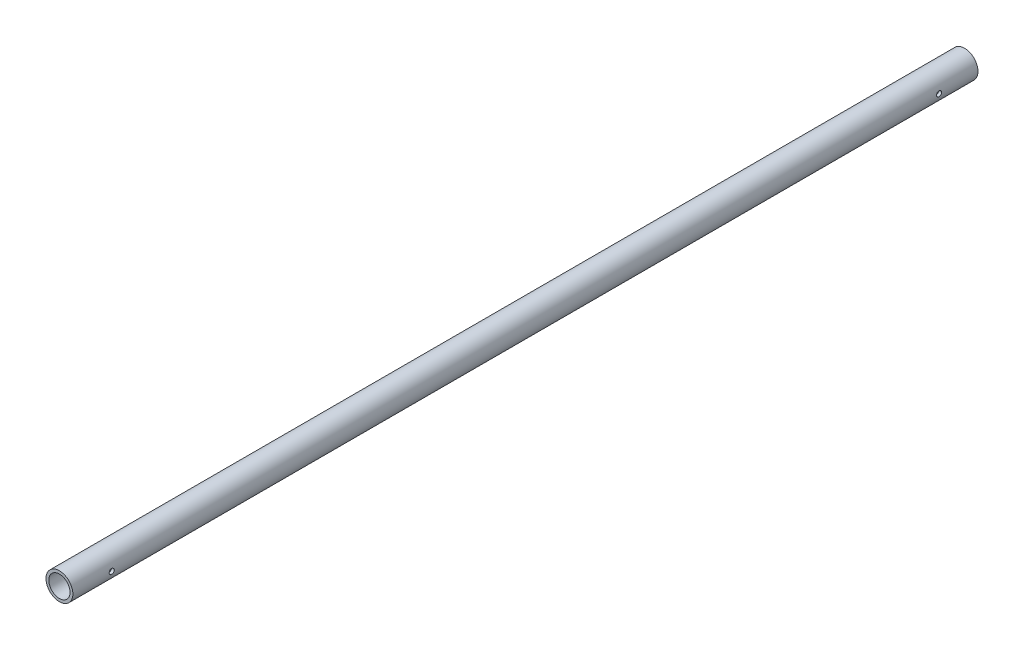
ISO-10303-21;
HEADER;
FILE_DESCRIPTION(('STEP AP214'),'2;1');
FILE_NAME('part.step','',(''),(''),'','','');
FILE_SCHEMA(('AUTOMOTIVE_DESIGN { 1 0 10303 214 1 1 1 1 }'));
ENDSEC;
DATA;
#1=APPLICATION_CONTEXT('core data for automotive mechanical design processes');
#2=APPLICATION_PROTOCOL_DEFINITION('international standard','automotive_design',2000,#1);
#3=PRODUCT_CONTEXT('',#1,'mechanical');
#4=PRODUCT('Part','Part','',(#3));
#5=PRODUCT_RELATED_PRODUCT_CATEGORY('part','',(#4));
#6=PRODUCT_DEFINITION_FORMATION('','',#4);
#7=PRODUCT_DEFINITION_CONTEXT('part definition',#1,'design');
#8=PRODUCT_DEFINITION('design','',#6,#7);
#9=PRODUCT_DEFINITION_SHAPE('','',#8);
#10=(LENGTH_UNIT() NAMED_UNIT(*) SI_UNIT(.MILLI.,.METRE.));
#11=(NAMED_UNIT(*) PLANE_ANGLE_UNIT() SI_UNIT($,.RADIAN.));
#12=(NAMED_UNIT(*) SI_UNIT($,.STERADIAN.) SOLID_ANGLE_UNIT());
#13=UNCERTAINTY_MEASURE_WITH_UNIT(LENGTH_MEASURE(1.E-05),#10,'distance_accuracy_value','');
#14=(GEOMETRIC_REPRESENTATION_CONTEXT(3) GLOBAL_UNCERTAINTY_ASSIGNED_CONTEXT((#13)) GLOBAL_UNIT_ASSIGNED_CONTEXT((#10,
#11,#12)) REPRESENTATION_CONTEXT('',''));
#15=CARTESIAN_POINT('',(0.,0.,0.));
#16=DIRECTION('',(0.,0.,1.));
#17=DIRECTION('',(1.,0.,0.));
#18=AXIS2_PLACEMENT_3D('',#15,#16,#17);
#19=CARTESIAN_POINT('',(0.,0.,406.4));
#20=DIRECTION('',(0.,0.,-1.));
#21=DIRECTION('',(-1.,0.,0.));
#22=AXIS2_PLACEMENT_3D('',#19,#20,#21);
#23=CYLINDRICAL_SURFACE('',#22,12.065);
#24=CARTESIAN_POINT('',(0.,0.,406.4));
#25=DIRECTION('',(0.,0.,1.));
#26=DIRECTION('',(1.,0.,0.));
#27=AXIS2_PLACEMENT_3D('',#24,#25,#26);
#28=CIRCLE('',#27,12.065);
#29=CARTESIAN_POINT('',(12.065,0.,406.4));
#30=VERTEX_POINT('',#29);
#31=EDGE_CURVE('E12',#30,#30,#28,.T.);
#32=ORIENTED_EDGE('',*,*,#31,.F.);
#33=EDGE_LOOP('',(#32));
#34=FACE_BOUND('',#33,.T.);
#35=CARTESIAN_POINT('',(0.,0.,-406.4));
#36=DIRECTION('',(0.,0.,1.));
#37=DIRECTION('',(1.,0.,0.));
#38=AXIS2_PLACEMENT_3D('',#35,#36,#37);
#39=CIRCLE('',#38,12.065);
#40=CARTESIAN_POINT('',(12.065,0.,-406.4));
#41=VERTEX_POINT('',#40);
#42=EDGE_CURVE('E49',#41,#41,#39,.T.);
#43=ORIENTED_EDGE('',*,*,#42,.T.);
#44=EDGE_LOOP('',(#43));
#45=FACE_BOUND('',#44,.T.);
#46=CARTESIAN_POINT('',(12.065,0.,373.761));
#47=CARTESIAN_POINT('',(12.0649976884321,0.12718599928569,373.760995166601));
#48=CARTESIAN_POINT('',(12.0629681130692,0.254434606003906,373.75034977691));
#49=CARTESIAN_POINT('',(12.0550673796494,0.505344333296518,373.70807788682));
#50=CARTESIAN_POINT('',(12.0491930087331,0.62900236311112,373.676433838825));
#51=CARTESIAN_POINT('',(12.0342596274528,0.86906610083774,373.593169719001));
#52=CARTESIAN_POINT('',(12.0252035207742,0.985478307718792,373.541567856567));
#53=CARTESIAN_POINT('',(12.0048949007203,1.20798239423987,373.419904958793));
#54=CARTESIAN_POINT('',(11.9936425578778,1.31407507421027,373.349845356507));
#55=CARTESIAN_POINT('',(11.9700291907526,1.51423499657303,373.192347294512));
#56=CARTESIAN_POINT('',(11.957657381634,1.6081579401749,373.104727047653));
#57=CARTESIAN_POINT('',(11.9332792621731,1.78006376066271,372.914985920394));
#58=CARTESIAN_POINT('',(11.9212729784833,1.85804547754153,372.812863985656));
#59=CARTESIAN_POINT('',(11.8988803987853,1.99645756333052,372.595995778333));
#60=CARTESIAN_POINT('',(11.8885080036478,2.05674074079455,372.481154001807));
#61=CARTESIAN_POINT('',(11.8707097448294,2.15710216113587,372.242743401801));
#62=CARTESIAN_POINT('',(11.8632836214172,2.19718218512528,372.119175348726));
#63=CARTESIAN_POINT('',(11.8523273520419,2.25553564429627,371.868365144754));
#64=CARTESIAN_POINT('',(11.8487522409,2.27406096594662,371.741183601051));
#65=CARTESIAN_POINT('',(11.845767249493,2.28956107931153,371.485471108973));
#66=CARTESIAN_POINT('',(11.8463569876959,2.28653784503818,371.356940285279));
#67=CARTESIAN_POINT('',(11.8515941366628,2.25923082112956,371.104005399244));
#68=CARTESIAN_POINT('',(11.8561868114863,2.23523381348081,370.979569074732));
#69=CARTESIAN_POINT('',(11.8688263468142,2.16711222768597,370.736521149793));
#70=CARTESIAN_POINT('',(11.8768733569103,2.12298677786224,370.617909801866));
#71=CARTESIAN_POINT('',(11.8955718925247,2.01558142696362,370.389041607623));
#72=CARTESIAN_POINT('',(11.9062390425539,1.95218605530477,370.278840279661));
#73=CARTESIAN_POINT('',(11.9289656534836,1.80812205757171,370.070531546809));
#74=CARTESIAN_POINT('',(11.9410252585169,1.72745164261909,369.972425396066));
#75=CARTESIAN_POINT('',(11.9654162535469,1.54958294504931,369.789435271703));
#76=CARTESIAN_POINT('',(11.9777488931034,1.45213944950717,369.704789634435));
#77=CARTESIAN_POINT('',(12.0011180252083,1.24431031242228,369.553010116202));
#78=CARTESIAN_POINT('',(12.0121545042334,1.13392453587152,369.485876417939));
#79=CARTESIAN_POINT('',(12.0317108000873,0.903093187934076,369.370989964118));
#80=CARTESIAN_POINT('',(12.0402273451256,0.782634796488711,369.323262374939));
#81=CARTESIAN_POINT('',(12.0537589784333,0.535213087908768,369.248785940254));
#82=CARTESIAN_POINT('',(12.0587744466574,0.408250478251043,369.222034818235));
#83=CARTESIAN_POINT('',(12.0646865167867,0.153474462917935,369.190603299374));
#84=CARTESIAN_POINT('',(12.0656440447249,0.0257027052074367,369.185596405484));
#85=CARTESIAN_POINT('',(12.0635007864804,-0.22885219417085,369.196919135289));
#86=CARTESIAN_POINT('',(12.0604002040871,-0.35563538516065,369.213247687563));
#87=CARTESIAN_POINT('',(12.0505270795847,-0.603575915097832,369.266506383044));
#88=CARTESIAN_POINT('',(12.0437840591771,-0.724770096048067,369.303270962321));
#89=CARTESIAN_POINT('',(12.027379071694,-0.959274301118755,369.396178665224));
#90=CARTESIAN_POINT('',(12.0177169031897,-1.07258378051032,369.45232312615));
#91=CARTESIAN_POINT('',(11.9963934272721,-1.28949302038036,369.583116980187));
#92=CARTESIAN_POINT('',(11.9847110616675,-1.39297064306977,369.657965423599));
#93=CARTESIAN_POINT('',(11.9606966362526,-1.58601411500325,369.823773656036));
#94=CARTESIAN_POINT('',(11.9483645144809,-1.67557863425272,369.914734983563));
#95=CARTESIAN_POINT('',(11.9242378595047,-1.83949712747983,370.111666325234));
#96=CARTESIAN_POINT('',(11.912452898326,-1.91362807912369,370.217823344179));
#97=CARTESIAN_POINT('',(11.8909490943957,-2.04300604433324,370.441274996372));
#98=CARTESIAN_POINT('',(11.88123017388,-2.09825376869521,370.558569210185));
#99=CARTESIAN_POINT('',(11.8650343251661,-2.18798260487899,370.800405279129));
#100=CARTESIAN_POINT('',(11.8585416036414,-2.22256505232827,370.924908428263));
#101=CARTESIAN_POINT('',(11.8494975990029,-2.27029341554196,371.178092877135));
#102=CARTESIAN_POINT('',(11.8469458606817,-2.28344180707841,371.306773692574));
#103=CARTESIAN_POINT('',(11.8460961660956,-2.28784462052635,371.562425951791));
#104=CARTESIAN_POINT('',(11.8477298407615,-2.27945093018968,371.689391241095));
#105=CARTESIAN_POINT('',(11.8549151190096,-2.24177920649581,371.940065932787));
#106=CARTESIAN_POINT('',(11.860466697999,-2.21250130422972,372.063775355606));
#107=CARTESIAN_POINT('',(11.8748331943178,-2.13404204434241,372.304232038502));
#108=CARTESIAN_POINT('',(11.8836417335642,-2.08489956995617,372.420992391497));
#109=CARTESIAN_POINT('',(11.9035340223865,-1.96814491202052,372.644666944877));
#110=CARTESIAN_POINT('',(11.914617937374,-1.90053138557479,372.751580428612));
#111=CARTESIAN_POINT('',(11.9380238614795,-1.74753386678967,372.954287423486));
#112=CARTESIAN_POINT('',(11.950362203489,-1.66189408144319,373.049886016774));
#113=CARTESIAN_POINT('',(11.9747653409863,-1.47580762081818,373.225472915441));
#114=CARTESIAN_POINT('',(11.9868300729896,-1.37535754892113,373.305457630098));
#115=CARTESIAN_POINT('',(12.0094572579251,-1.16139137455459,373.448236672184));
#116=CARTESIAN_POINT('',(12.0200048282975,-1.04776330374446,373.510865640553));
#117=CARTESIAN_POINT('',(12.0382637695444,-0.811433346028346,373.616043726833));
#118=CARTESIAN_POINT('',(12.0459777864253,-0.688740053624382,373.658611588616));
#119=CARTESIAN_POINT('',(12.0561391271294,-0.47141576328754,373.713877213179));
#120=CARTESIAN_POINT('',(12.0594430847409,-0.37805031763618,373.731517858245));
#121=CARTESIAN_POINT('',(12.0638743550481,-0.189801511121116,373.755080900805));
#122=CARTESIAN_POINT('',(12.0650017251101,-0.0949181903290307,373.761003607138));
#123=CARTESIAN_POINT('',(12.065,0.,373.761));
#124=B_SPLINE_CURVE_WITH_KNOTS('',3,(#46,#47,#48,#49,#50,#51,#52,#53,#54,#55,#56,#57,#58,#59,
#60,#61,#62,#63,#64,#65,#66,#67,#68,#69,#70,#71,#72,#73,#74,#75,#76,#77,#78,#79,#80,#81,#82,#83,
#84,#85,#86,#87,#88,#89,#90,#91,#92,#93,#94,#95,#96,#97,#98,#99,#100,#101,#102,#103,#104,#105,
#106,#107,#108,#109,#110,#111,#112,#113,#114,#115,#116,#117,#118,#119,#120,#121,#122,#123),
.UNSPECIFIED.,.T.,.F.,(4,2,2,2,2,2,2,2,2,2,2,2,2,2,2,2,2,2,2,2,2,2,2,2,2,2,2,2,2,2,2,2,2,2,2,2,
2,2,4),(0.,0.381210857966675,0.762740677826818,1.1439232101407,1.52507615625258,
1.91040005661856,2.29575198616267,2.68422340549806,3.07266057116047,3.45651139514349,
3.84032705591504,4.21897534959227,4.5976400424812,4.9786200890732,5.35963960629399,
5.74679421700129,6.13395286668961,6.52161200526133,6.90922906653218,7.29100534878903,
7.67276245982128,8.05147089057368,8.43020545916115,8.81315634017609,9.19614380609841,
9.5843310687785,9.97250371783041,10.3587569356338,10.7449655355313,11.1249057525114,
11.5048435846111,11.8840412939611,12.2632665793683,12.6482875521156,13.0333969640357,
13.4220584117291,13.8103559944182,14.0948589953442,14.3793544977989),.UNSPECIFIED.);
#125=CARTESIAN_POINT('',(12.065,0.,373.761));
#126=VERTEX_POINT('',#125);
#127=EDGE_CURVE('E64',#126,#126,#124,.T.);
#128=ORIENTED_EDGE('',*,*,#127,.T.);
#129=EDGE_LOOP('',(#128));
#130=FACE_BOUND('',#129,.T.);
#131=CARTESIAN_POINT('',(12.065,0.,-369.189));
#132=CARTESIAN_POINT('',(12.0649976884321,0.12718599928569,-369.189004833399));
#133=CARTESIAN_POINT('',(12.0629681130692,0.254434606003905,-369.19965022309));
#134=CARTESIAN_POINT('',(12.0550673796494,0.505344333296519,-369.24192211318));
#135=CARTESIAN_POINT('',(12.0491930087331,0.629002363111123,-369.273566161175));
#136=CARTESIAN_POINT('',(12.0342596274528,0.869066100837757,-369.356830280999));
#137=CARTESIAN_POINT('',(12.0252035207742,0.985478307718821,-369.408432143433));
#138=CARTESIAN_POINT('',(12.0048949007203,1.20798239423989,-369.530095041207));
#139=CARTESIAN_POINT('',(11.9936425578778,1.31407507421028,-369.600154643493));
#140=CARTESIAN_POINT('',(11.9700291907526,1.51423499657304,-369.757652705488));
#141=CARTESIAN_POINT('',(11.957657381634,1.6081579401749,-369.845272952347));
#142=CARTESIAN_POINT('',(11.9332792621731,1.78006376066271,-370.035014079606));
#143=CARTESIAN_POINT('',(11.9212729784833,1.85804547754153,-370.137136014344));
#144=CARTESIAN_POINT('',(11.8988803987853,1.99645756333052,-370.354004221667));
#145=CARTESIAN_POINT('',(11.8885080036478,2.05674074079455,-370.468845998193));
#146=CARTESIAN_POINT('',(11.8707097448294,2.15710216113587,-370.707256598199));
#147=CARTESIAN_POINT('',(11.8632836214172,2.19718218512528,-370.830824651274));
#148=CARTESIAN_POINT('',(11.8523273520419,2.25553564429626,-371.081634855246));
#149=CARTESIAN_POINT('',(11.8487522409,2.27406096594661,-371.208816398949));
#150=CARTESIAN_POINT('',(11.845767249493,2.28956107931153,-371.464528891027));
#151=CARTESIAN_POINT('',(11.8463569876959,2.28653784503819,-371.593059714721));
#152=CARTESIAN_POINT('',(11.8515941366628,2.25923082112956,-371.845994600756));
#153=CARTESIAN_POINT('',(11.8561868114863,2.23523381348081,-371.970430925268));
#154=CARTESIAN_POINT('',(11.8688263468142,2.16711222768597,-372.213478850207));
#155=CARTESIAN_POINT('',(11.8768733569103,2.12298677786224,-372.332090198134));
#156=CARTESIAN_POINT('',(11.8955718925247,2.01558142696362,-372.560958392377));
#157=CARTESIAN_POINT('',(11.9062390425539,1.95218605530477,-372.671159720339));
#158=CARTESIAN_POINT('',(11.9289656534836,1.80812205757171,-372.879468453191));
#159=CARTESIAN_POINT('',(11.9410252585169,1.72745164261909,-372.977574603934));
#160=CARTESIAN_POINT('',(11.9654162535469,1.54958294504931,-373.160564728296));
#161=CARTESIAN_POINT('',(11.9777488931034,1.45213944950717,-373.245210365565));
#162=CARTESIAN_POINT('',(12.0011180252083,1.24431031242228,-373.396989883798));
#163=CARTESIAN_POINT('',(12.0121545042334,1.13392453587152,-373.464123582061));
#164=CARTESIAN_POINT('',(12.0317108000873,0.903093187934076,-373.579010035882));
#165=CARTESIAN_POINT('',(12.0402273451256,0.782634796488711,-373.626737625061));
#166=CARTESIAN_POINT('',(12.0537589784333,0.535213087908768,-373.701214059746));
#167=CARTESIAN_POINT('',(12.0587744466574,0.408250478251043,-373.727965181765));
#168=CARTESIAN_POINT('',(12.0646865167867,0.153474462917935,-373.759396700626));
#169=CARTESIAN_POINT('',(12.0656440447249,0.0257027052074377,-373.764403594516));
#170=CARTESIAN_POINT('',(12.0635007864804,-0.228852194170851,-373.753080864711));
#171=CARTESIAN_POINT('',(12.0604002040871,-0.355635385160654,-373.736752312437));
#172=CARTESIAN_POINT('',(12.0505270795847,-0.603575915097839,-373.683493616956));
#173=CARTESIAN_POINT('',(12.0437840591771,-0.724770096048074,-373.646729037679));
#174=CARTESIAN_POINT('',(12.027379071694,-0.959274301118762,-373.553821334776));
#175=CARTESIAN_POINT('',(12.0177169031896,-1.07258378051032,-373.49767687385));
#176=CARTESIAN_POINT('',(11.9963934272721,-1.28949302038036,-373.366883019813));
#177=CARTESIAN_POINT('',(11.9847110616675,-1.39297064306977,-373.292034576401));
#178=CARTESIAN_POINT('',(11.9606966362526,-1.58601411500325,-373.126226343964));
#179=CARTESIAN_POINT('',(11.9483645144809,-1.67557863425272,-373.035265016437));
#180=CARTESIAN_POINT('',(11.9242378595047,-1.83949712747985,-372.838333674766));
#181=CARTESIAN_POINT('',(11.912452898326,-1.91362807912371,-372.732176655821));
#182=CARTESIAN_POINT('',(11.8909490943957,-2.04300604433325,-372.508725003627));
#183=CARTESIAN_POINT('',(11.88123017388,-2.09825376869522,-372.391430789815));
#184=CARTESIAN_POINT('',(11.8650343251661,-2.18798260487898,-372.149594720871));
#185=CARTESIAN_POINT('',(11.8585416036414,-2.22256505232826,-372.025091571737));
#186=CARTESIAN_POINT('',(11.8494975990029,-2.27029341554196,-371.771907122865));
#187=CARTESIAN_POINT('',(11.8469458606817,-2.2834418070784,-371.643226307426));
#188=CARTESIAN_POINT('',(11.8460961660956,-2.28784462052634,-371.387574048209));
#189=CARTESIAN_POINT('',(11.8477298407615,-2.27945093018967,-371.260608758905));
#190=CARTESIAN_POINT('',(11.8549151190096,-2.24177920649581,-371.009934067213));
#191=CARTESIAN_POINT('',(11.860466697999,-2.21250130422972,-370.886224644394));
#192=CARTESIAN_POINT('',(11.8748331943178,-2.13404204434242,-370.645767961498));
#193=CARTESIAN_POINT('',(11.8836417335642,-2.08489956995618,-370.529007608503));
#194=CARTESIAN_POINT('',(11.9035340223865,-1.96814491202054,-370.305333055123));
#195=CARTESIAN_POINT('',(11.914617937374,-1.9005313855748,-370.198419571388));
#196=CARTESIAN_POINT('',(11.9380238614795,-1.74753386678967,-369.995712576514));
#197=CARTESIAN_POINT('',(11.950362203489,-1.66189408144319,-369.900113983226));
#198=CARTESIAN_POINT('',(11.9747653409863,-1.47580762081818,-369.724527084559));
#199=CARTESIAN_POINT('',(11.9868300729896,-1.37535754892113,-369.644542369902));
#200=CARTESIAN_POINT('',(12.0094572579251,-1.16139137455459,-369.501763327816));
#201=CARTESIAN_POINT('',(12.0200048282975,-1.04776330374446,-369.439134359447));
#202=CARTESIAN_POINT('',(12.0382637695444,-0.811433346028346,-369.333956273167));
#203=CARTESIAN_POINT('',(12.0459777864253,-0.688740053624382,-369.291388411385));
#204=CARTESIAN_POINT('',(12.0561391271294,-0.47141576328754,-369.236122786821));
#205=CARTESIAN_POINT('',(12.0594430847409,-0.37805031763618,-369.218482141755));
#206=CARTESIAN_POINT('',(12.0638743550481,-0.189801511121116,-369.194919099195));
#207=CARTESIAN_POINT('',(12.0650017251101,-0.0949181903290306,-369.188996392862));
#208=CARTESIAN_POINT('',(12.065,0.,-369.189));
#209=B_SPLINE_CURVE_WITH_KNOTS('',3,(#131,#132,#133,#134,#135,#136,#137,#138,#139,#140,#141,
#142,#143,#144,#145,#146,#147,#148,#149,#150,#151,#152,#153,#154,#155,#156,#157,#158,#159,#160,
#161,#162,#163,#164,#165,#166,#167,#168,#169,#170,#171,#172,#173,#174,#175,#176,#177,#178,#179,
#180,#181,#182,#183,#184,#185,#186,#187,#188,#189,#190,#191,#192,#193,#194,#195,#196,#197,#198,
#199,#200,#201,#202,#203,#204,#205,#206,#207,#208),.UNSPECIFIED.,.T.,.F.,(4,2,2,2,2,2,2,2,2,2,2,
2,2,2,2,2,2,2,2,2,2,2,2,2,2,2,2,2,2,2,2,2,2,2,2,2,2,2,4),(0.,0.381210857966675,
0.762740677826818,1.14392321014076,1.52507615625257,1.91040005661856,2.29575198616267,
2.68422340549806,3.07266057116046,3.45651139514338,3.84032705591504,4.21897534959226,
4.5976400424812,4.97862008907319,5.35963960629399,5.74679421700129,6.13395286668961,
6.52161200526132,6.90922906653217,7.29100534878903,7.67276245982127,8.05147089057371,
8.43020545916114,8.81315634017607,9.19614380609839,9.58433106877854,9.97250371783039,
10.3587569356338,10.7449655355313,11.1249057525114,11.504843584611,11.884041293961,
12.2632665793683,12.6482875521156,13.0333969640357,13.4220584117291,13.8103559944182,
14.0948589953442,14.3793544977988),.UNSPECIFIED.);
#210=CARTESIAN_POINT('',(12.065,0.,-369.189));
#211=VERTEX_POINT('',#210);
#212=EDGE_CURVE('E93',#211,#211,#209,.T.);
#213=ORIENTED_EDGE('',*,*,#212,.T.);
#214=EDGE_LOOP('',(#213));
#215=FACE_BOUND('',#214,.T.);
#216=ADVANCED_FACE('F46',(#34,#45,#130,#215),#23,.T.);
#217=CARTESIAN_POINT('',(0.,0.,406.4));
#218=DIRECTION('',(0.,0.,-1.));
#219=DIRECTION('',(-1.,0.,0.));
#220=AXIS2_PLACEMENT_3D('',#217,#218,#219);
#221=CYLINDRICAL_SURFACE('',#220,9.525);
#222=CARTESIAN_POINT('',(9.525,0.,373.761));
#223=CARTESIAN_POINT('',(9.52499776848054,0.126464513919884,373.760996171653));
#224=CARTESIAN_POINT('',(9.52245611137625,0.252972890747192,373.7504703714));
#225=CARTESIAN_POINT('',(9.51256293675626,0.502374629720199,373.708701852428));
#226=CARTESIAN_POINT('',(9.50520845681702,0.625265716609285,373.677446373868));
#227=CARTESIAN_POINT('',(9.48650552846446,0.863794356772103,373.595270841108));
#228=CARTESIAN_POINT('',(9.4751616721565,0.979440070515182,373.544373389929));
#229=CARTESIAN_POINT('',(9.4496934787195,1.20055018624383,373.424435697428));
#230=CARTESIAN_POINT('',(9.43556910183951,1.30601444264079,373.355395196725));
#231=CARTESIAN_POINT('',(9.40577641432659,1.50578258706207,373.199738096078));
#232=CARTESIAN_POINT('',(9.39008580101847,1.59986435500564,373.112840680841));
#233=CARTESIAN_POINT('',(9.35908016700521,1.77226783578699,372.924538221773));
#234=CARTESIAN_POINT('',(9.34376518570723,1.85058790123861,372.823131663365));
#235=CARTESIAN_POINT('',(9.31502173242521,1.99026775088924,372.606992275241));
#236=CARTESIAN_POINT('',(9.30162166712679,2.05138307310247,372.492097343176));
#237=CARTESIAN_POINT('',(9.27854888602851,2.15334786205871,372.253291685632));
#238=CARTESIAN_POINT('',(9.26887562535432,2.19420029157211,372.129382281258));
#239=CARTESIAN_POINT('',(9.25458027223556,2.25372974278805,371.878496851169));
#240=CARTESIAN_POINT('',(9.24986778681693,2.27280415949273,371.751620385398));
#241=CARTESIAN_POINT('',(9.24575668797304,2.28947326365868,371.496387526712));
#242=CARTESIAN_POINT('',(9.24635728163768,2.28707115621992,371.368031357481));
#243=CARTESIAN_POINT('',(9.25272302768996,2.26117337006444,371.116497313898));
#244=CARTESIAN_POINT('',(9.25837322220246,2.23814718791181,370.993267741326));
#245=CARTESIAN_POINT('',(9.27401882089543,2.17240211927541,370.752473644714));
#246=CARTESIAN_POINT('',(9.28401451289392,2.12968192837487,370.63490949649));
#247=CARTESIAN_POINT('',(9.30733292716469,2.02535120378621,370.4075043107));
#248=CARTESIAN_POINT('',(9.32068603162274,1.96356692564188,370.297746230877));
#249=CARTESIAN_POINT('',(9.34919707852016,1.82298356984768,370.089985370449));
#250=CARTESIAN_POINT('',(9.36435531362966,1.74418173141101,369.991984501253));
#251=CARTESIAN_POINT('',(9.39525580361312,1.56935038358545,369.807825099417));
#252=CARTESIAN_POINT('',(9.41100295504665,1.47292363065114,369.722044070515));
#253=CARTESIAN_POINT('',(9.4409477115336,1.26686761454288,369.567801843553));
#254=CARTESIAN_POINT('',(9.4551452762641,1.15723800796393,369.499341096137));
#255=CARTESIAN_POINT('',(9.48045309571742,0.927375699615604,369.381559517893));
#256=CARTESIAN_POINT('',(9.49155407182105,0.80711252366396,369.332296038347));
#257=CARTESIAN_POINT('',(9.50935008013054,0.559687175831973,369.254787209765));
#258=CARTESIAN_POINT('',(9.51604588724918,0.432526221601407,369.226538163968));
#259=CARTESIAN_POINT('',(9.5241638987544,0.178145998534566,369.192427426735));
#260=CARTESIAN_POINT('',(9.52570729836342,0.0509995021752958,369.186051141944));
#261=CARTESIAN_POINT('',(9.52368992536386,-0.20254293876901,369.19446107634));
#262=CARTESIAN_POINT('',(9.52012957399092,-0.328938944430893,369.209245549034));
#263=CARTESIAN_POINT('',(9.50838202931562,-0.575632006042939,369.259132177629));
#264=CARTESIAN_POINT('',(9.50025798118596,-0.695988381435209,369.293957201495));
#265=CARTESIAN_POINT('',(9.48029612819329,-0.929147214702676,369.382622822072));
#266=CARTESIAN_POINT('',(9.46845796614383,-1.04194894478081,369.436465247749));
#267=CARTESIAN_POINT('',(9.44208755339933,-1.25887087058628,369.562659344322));
#268=CARTESIAN_POINT('',(9.42751377217068,-1.36281548676161,369.635303946297));
#269=CARTESIAN_POINT('',(9.39736015420786,-1.55722246921628,369.796662179908));
#270=CARTESIAN_POINT('',(9.38178015846291,-1.64768269706617,369.885378355333));
#271=CARTESIAN_POINT('',(9.35093955129653,-1.81464549787969,370.078742313382));
#272=CARTESIAN_POINT('',(9.33569399788101,-1.89078850224215,370.18370346303));
#273=CARTESIAN_POINT('',(9.30764245630018,-2.02437507867836,370.405220906054));
#274=CARTESIAN_POINT('',(9.29483635891158,-2.08181948803759,370.521776679939));
#275=CARTESIAN_POINT('',(9.27324964161758,-2.17595953061086,370.762539535329));
#276=CARTESIAN_POINT('',(9.26444533759699,-2.21277754843367,370.886696531048));
#277=CARTESIAN_POINT('',(9.25182853787851,-2.26495645777748,371.139678993029));
#278=CARTESIAN_POINT('',(9.24801505130659,-2.28032160857887,371.268503527381));
#279=CARTESIAN_POINT('',(9.2458829217781,-2.28894944634098,371.523517073606));
#280=CARTESIAN_POINT('',(9.24742181243666,-2.28278517223226,371.649685830199));
#281=CARTESIAN_POINT('',(9.25549404634695,-2.24983049367304,371.899129020341));
#282=CARTESIAN_POINT('',(9.26202730401685,-2.223040442659,372.022403503447));
#283=CARTESIAN_POINT('',(9.27927595321152,-2.14989606573278,372.261991735041));
#284=CARTESIAN_POINT('',(9.28997005813914,-2.10364122358756,372.378337491709));
#285=CARTESIAN_POINT('',(9.31434004129112,-1.99296050668416,372.60169656338));
#286=CARTESIAN_POINT('',(9.32801630013581,-1.92853231210366,372.708708684663));
#287=CARTESIAN_POINT('',(9.35722232605189,-1.7815027187385,372.913150794091));
#288=CARTESIAN_POINT('',(9.37278887675165,-1.69850004200012,373.010286990201));
#289=CARTESIAN_POINT('',(9.40379321913357,-1.51747022977207,373.189439030896));
#290=CARTESIAN_POINT('',(9.41923097972044,-1.41943957062167,373.271451319366));
#291=CARTESIAN_POINT('',(9.448538656828,-1.20920484508668,373.419326255781));
#292=CARTESIAN_POINT('',(9.46237885533287,-1.09679547741866,373.484903324947));
#293=CARTESIAN_POINT('',(9.48662420252634,-0.862230605953696,373.596125703954));
#294=CARTESIAN_POINT('',(9.49703195379153,-0.740082573952724,373.641786123664));
#295=CARTESIAN_POINT('',(9.51159336449406,-0.515025913579419,373.704641432355));
#296=CARTESIAN_POINT('',(9.51658747805795,-0.413241794496542,373.725732061229));
#297=CARTESIAN_POINT('',(9.52329160739379,-0.207648221338427,373.753912471009));
#298=CARTESIAN_POINT('',(9.52500183228094,-0.103838896651823,373.761003143422));
#299=CARTESIAN_POINT('',(9.525,0.,373.761));
#300=B_SPLINE_CURVE_WITH_KNOTS('',3,(#222,#223,#224,#225,#226,#227,#228,#229,#230,#231,#232,
#233,#234,#235,#236,#237,#238,#239,#240,#241,#242,#243,#244,#245,#246,#247,#248,#249,#250,#251,
#252,#253,#254,#255,#256,#257,#258,#259,#260,#261,#262,#263,#264,#265,#266,#267,#268,#269,#270,
#271,#272,#273,#274,#275,#276,#277,#278,#279,#280,#281,#282,#283,#284,#285,#286,#287,#288,#289,
#290,#291,#292,#293,#294,#295,#296,#297,#298,#299),.UNSPECIFIED.,.T.,.F.,(4,2,2,2,2,2,2,2,2,2,2,
2,2,2,2,2,2,2,2,2,2,2,2,2,2,2,2,2,2,2,2,2,2,2,2,2,2,2,4),(0.,0.37901316071741,0.758259834068232,
1.13707138403284,1.51588834996873,1.90119434453042,2.28654058972378,2.67711373682753,
3.06762975882303,3.45089984463641,3.83411273318515,4.20881765523216,4.58354739912371,
4.96179856651139,5.34011114436909,5.72833468287042,6.11656832121163,6.505953063848,
6.89526929153008,7.27536093929861,7.65542121819209,8.03034795275805,8.40531075509638,
8.78650947651129,9.16776858637679,9.55760022866737,9.94741441267874,10.3348904898589,
10.7222896260849,11.0994570076147,11.4766179262732,11.8518741639343,12.2271783246221,
12.6115453592814,12.9960026559867,13.3867378344905,13.7771760619476,14.0884002435307,
14.3996046059683),.UNSPECIFIED.);
#301=CARTESIAN_POINT('',(9.525,0.,373.761));
#302=VERTEX_POINT('',#301);
#303=EDGE_CURVE('E61',#302,#302,#300,.T.);
#304=ORIENTED_EDGE('',*,*,#303,.F.);
#305=EDGE_LOOP('',(#304));
#306=FACE_BOUND('',#305,.T.);
#307=CARTESIAN_POINT('',(0.,0.,406.4));
#308=DIRECTION('',(0.,0.,1.));
#309=DIRECTION('',(1.,0.,0.));
#310=AXIS2_PLACEMENT_3D('',#307,#308,#309);
#311=CIRCLE('',#310,9.525);
#312=CARTESIAN_POINT('',(9.525,0.,406.4));
#313=VERTEX_POINT('',#312);
#314=EDGE_CURVE('E56',#313,#313,#311,.T.);
#315=ORIENTED_EDGE('',*,*,#314,.T.);
#316=EDGE_LOOP('',(#315));
#317=FACE_BOUND('',#316,.T.);
#318=CARTESIAN_POINT('',(0.,0.,-406.4));
#319=DIRECTION('',(0.,0.,1.));
#320=DIRECTION('',(1.,0.,0.));
#321=AXIS2_PLACEMENT_3D('',#318,#319,#320);
#322=CIRCLE('',#321,9.525);
#323=CARTESIAN_POINT('',(9.525,0.,-406.4));
#324=VERTEX_POINT('',#323);
#325=EDGE_CURVE('E58',#324,#324,#322,.T.);
#326=ORIENTED_EDGE('',*,*,#325,.F.);
#327=EDGE_LOOP('',(#326));
#328=FACE_BOUND('',#327,.T.);
#329=CARTESIAN_POINT('',(9.525,0.,-369.189));
#330=CARTESIAN_POINT('',(9.52499776848054,0.126464513919884,-369.189003828347));
#331=CARTESIAN_POINT('',(9.52245611137625,0.252972890747193,-369.1995296286));
#332=CARTESIAN_POINT('',(9.51256293675626,0.502374629720199,-369.241298147572));
#333=CARTESIAN_POINT('',(9.50520845681702,0.625265716609283,-369.272553626132));
#334=CARTESIAN_POINT('',(9.48650552846446,0.863794356772077,-369.354729158892));
#335=CARTESIAN_POINT('',(9.4751616721565,0.979440070515136,-369.405626610071));
#336=CARTESIAN_POINT('',(9.44969347871951,1.20055018624379,-369.525564302572));
#337=CARTESIAN_POINT('',(9.43556910183951,1.30601444264077,-369.594604803275));
#338=CARTESIAN_POINT('',(9.40577641432659,1.5057825870621,-369.750261903922));
#339=CARTESIAN_POINT('',(9.39008580101846,1.5998643550057,-369.83715931916));
#340=CARTESIAN_POINT('',(9.3590801670052,1.77226783578704,-370.025461778227));
#341=CARTESIAN_POINT('',(9.34376518570723,1.85058790123863,-370.126868336635));
#342=CARTESIAN_POINT('',(9.31502173242521,1.99026775088923,-370.343007724759));
#343=CARTESIAN_POINT('',(9.30162166712679,2.05138307310246,-370.457902656824));
#344=CARTESIAN_POINT('',(9.27854888602852,2.1533478620587,-370.696708314368));
#345=CARTESIAN_POINT('',(9.26887562535432,2.19420029157211,-370.820617718742));
#346=CARTESIAN_POINT('',(9.25458027223556,2.25372974278805,-371.071503148831));
#347=CARTESIAN_POINT('',(9.24986778681693,2.27280415949273,-371.198379614602));
#348=CARTESIAN_POINT('',(9.24575668797304,2.28947326365868,-371.453612473288));
#349=CARTESIAN_POINT('',(9.24635728163768,2.28707115621992,-371.581968642519));
#350=CARTESIAN_POINT('',(9.25272302768996,2.26117337006444,-371.833502686102));
#351=CARTESIAN_POINT('',(9.25837322220246,2.23814718791182,-371.956732258674));
#352=CARTESIAN_POINT('',(9.27401882089543,2.17240211927543,-372.197526355286));
#353=CARTESIAN_POINT('',(9.28401451289392,2.12968192837489,-372.31509050351));
#354=CARTESIAN_POINT('',(9.30733292716469,2.02535120378621,-372.5424956893));
#355=CARTESIAN_POINT('',(9.32068603162274,1.96356692564188,-372.652253769123));
#356=CARTESIAN_POINT('',(9.34919707852016,1.82298356984768,-372.860014629551));
#357=CARTESIAN_POINT('',(9.36435531362966,1.74418173141101,-372.958015498747));
#358=CARTESIAN_POINT('',(9.39525580361312,1.56935038358545,-373.142174900583));
#359=CARTESIAN_POINT('',(9.41100295504665,1.47292363065114,-373.227955929485));
#360=CARTESIAN_POINT('',(9.4409477115336,1.26686761454288,-373.382198156447));
#361=CARTESIAN_POINT('',(9.4551452762641,1.15723800796393,-373.450658903863));
#362=CARTESIAN_POINT('',(9.48045309571742,0.927375699615604,-373.568440482107));
#363=CARTESIAN_POINT('',(9.49155407182105,0.80711252366396,-373.617703961653));
#364=CARTESIAN_POINT('',(9.50935008013054,0.559687175831973,-373.695212790235));
#365=CARTESIAN_POINT('',(9.51604588724918,0.432526221601407,-373.723461836032));
#366=CARTESIAN_POINT('',(9.5241638987544,0.178145998534566,-373.757572573265));
#367=CARTESIAN_POINT('',(9.52570729836342,0.0509995021752946,-373.763948858056));
#368=CARTESIAN_POINT('',(9.52368992536386,-0.202542938769011,-373.75553892366));
#369=CARTESIAN_POINT('',(9.52012957399092,-0.328938944430894,-373.740754450966));
#370=CARTESIAN_POINT('',(9.50838202931562,-0.575632006042939,-373.690867822371));
#371=CARTESIAN_POINT('',(9.50025798118596,-0.695988381435209,-373.656042798505));
#372=CARTESIAN_POINT('',(9.48029612819329,-0.929147214702676,-373.567377177928));
#373=CARTESIAN_POINT('',(9.46845796614383,-1.04194894478081,-373.513534752251));
#374=CARTESIAN_POINT('',(9.44208755339933,-1.25887087058628,-373.387340655678));
#375=CARTESIAN_POINT('',(9.42751377217068,-1.36281548676161,-373.314696053703));
#376=CARTESIAN_POINT('',(9.39736015420786,-1.55722246921628,-373.153337820092));
#377=CARTESIAN_POINT('',(9.38178015846291,-1.64768269706617,-373.064621644667));
#378=CARTESIAN_POINT('',(9.35093955129653,-1.81464549787969,-372.871257686618));
#379=CARTESIAN_POINT('',(9.33569399788101,-1.89078850224215,-372.76629653697));
#380=CARTESIAN_POINT('',(9.30764245630018,-2.02437507867836,-372.544779093946));
#381=CARTESIAN_POINT('',(9.29483635891158,-2.08181948803759,-372.428223320061));
#382=CARTESIAN_POINT('',(9.27324964161758,-2.17595953061086,-372.187460464671));
#383=CARTESIAN_POINT('',(9.26444533759699,-2.21277754843367,-372.063303468952));
#384=CARTESIAN_POINT('',(9.25182853787851,-2.26495645777748,-371.810321006971));
#385=CARTESIAN_POINT('',(9.24801505130659,-2.28032160857887,-371.681496472619));
#386=CARTESIAN_POINT('',(9.2458829217781,-2.28894944634098,-371.426482926394));
#387=CARTESIAN_POINT('',(9.24742181243666,-2.28278517223226,-371.300314169801));
#388=CARTESIAN_POINT('',(9.25549404634695,-2.24983049367304,-371.050870979659));
#389=CARTESIAN_POINT('',(9.26202730401685,-2.22304044265901,-370.927596496553));
#390=CARTESIAN_POINT('',(9.27927595321152,-2.14989606573277,-370.688008264959));
#391=CARTESIAN_POINT('',(9.28997005813915,-2.10364122358752,-370.571662508291));
#392=CARTESIAN_POINT('',(9.31434004129113,-1.9929605066841,-370.34830343662));
#393=CARTESIAN_POINT('',(9.32801630013581,-1.92853231210363,-370.241291315337));
#394=CARTESIAN_POINT('',(9.35722232605189,-1.7815027187385,-370.036849205909));
#395=CARTESIAN_POINT('',(9.37278887675165,-1.69850004200012,-369.939713009799));
#396=CARTESIAN_POINT('',(9.40379321913357,-1.51747022977207,-369.760560969104));
#397=CARTESIAN_POINT('',(9.41923097972044,-1.41943957062167,-369.678548680634));
#398=CARTESIAN_POINT('',(9.448538656828,-1.20920484508668,-369.530673744219));
#399=CARTESIAN_POINT('',(9.46237885533287,-1.09679547741866,-369.465096675053));
#400=CARTESIAN_POINT('',(9.48662420252634,-0.862230605953696,-369.353874296046));
#401=CARTESIAN_POINT('',(9.49703195379153,-0.740082573952724,-369.308213876336));
#402=CARTESIAN_POINT('',(9.51159336449406,-0.515025913579419,-369.245358567645));
#403=CARTESIAN_POINT('',(9.51658747805795,-0.413241794496542,-369.224267938771));
#404=CARTESIAN_POINT('',(9.52329160739379,-0.207648221338427,-369.196087528991));
#405=CARTESIAN_POINT('',(9.52500183228094,-0.103838896651823,-369.188996856578));
#406=CARTESIAN_POINT('',(9.525,0.,-369.189));
#407=B_SPLINE_CURVE_WITH_KNOTS('',3,(#329,#330,#331,#332,#333,#334,#335,#336,#337,#338,#339,
#340,#341,#342,#343,#344,#345,#346,#347,#348,#349,#350,#351,#352,#353,#354,#355,#356,#357,#358,
#359,#360,#361,#362,#363,#364,#365,#366,#367,#368,#369,#370,#371,#372,#373,#374,#375,#376,#377,
#378,#379,#380,#381,#382,#383,#384,#385,#386,#387,#388,#389,#390,#391,#392,#393,#394,#395,#396,
#397,#398,#399,#400,#401,#402,#403,#404,#405,#406),.UNSPECIFIED.,.T.,.F.,(4,2,2,2,2,2,2,2,2,2,2,
2,2,2,2,2,2,2,2,2,2,2,2,2,2,2,2,2,2,2,2,2,2,2,2,2,2,2,4),(0.,0.37901316071741,0.758259834068232,
1.13707138403276,1.51588834996873,1.90119434453056,2.28654058972378,2.67711373682747,
3.06762975882303,3.45089984463641,3.83411273318515,4.20881765523205,4.58354739912371,
4.96179856651139,5.34011114436909,5.72833468287042,6.11656832121163,6.505953063848,
6.89526929153008,7.27536093929861,7.65542121819209,8.03034795275805,8.40531075509638,
8.78650947651129,9.16776858637679,9.55760022866737,9.94741441267874,10.3348904898589,
10.7222896260849,11.0994570076147,11.4766179262732,11.8518741639344,12.2271783246221,
12.6115453592814,12.9960026559867,13.3867378344905,13.7771760619476,14.0884002435307,
14.3996046059683),.UNSPECIFIED.);
#408=CARTESIAN_POINT('',(9.525,0.,-369.189));
#409=VERTEX_POINT('',#408);
#410=EDGE_CURVE('E71',#409,#409,#407,.T.);
#411=ORIENTED_EDGE('',*,*,#410,.F.);
#412=EDGE_LOOP('',(#411));
#413=FACE_BOUND('',#412,.T.);
#414=ADVANCED_FACE('F103',(#306,#317,#328,#413),#221,.F.);
#415=CARTESIAN_POINT('',(0.,0.,406.4));
#416=DIRECTION('',(0.,0.,1.));
#417=DIRECTION('',(1.,0.,0.));
#418=AXIS2_PLACEMENT_3D('',#415,#416,#417);
#419=PLANE('',#418);
#420=ORIENTED_EDGE('',*,*,#31,.T.);
#421=EDGE_LOOP('',(#420));
#422=FACE_BOUND('',#421,.T.);
#423=ORIENTED_EDGE('',*,*,#314,.F.);
#424=EDGE_LOOP('',(#423));
#425=FACE_BOUND('',#424,.T.);
#426=ADVANCED_FACE('F105',(#422,#425),#419,.T.);
#427=CARTESIAN_POINT('',(0.,0.,-406.4));
#428=DIRECTION('',(0.,0.,1.));
#429=DIRECTION('',(1.,0.,0.));
#430=AXIS2_PLACEMENT_3D('',#427,#428,#429);
#431=PLANE('',#430);
#432=ORIENTED_EDGE('',*,*,#42,.F.);
#433=EDGE_LOOP('',(#432));
#434=FACE_BOUND('',#433,.T.);
#435=ORIENTED_EDGE('',*,*,#325,.T.);
#436=EDGE_LOOP('',(#435));
#437=FACE_BOUND('',#436,.T.);
#438=ADVANCED_FACE('F111',(#434,#437),#431,.F.);
#439=CARTESIAN_POINT('',(12.066,0.,371.475));
#440=DIRECTION('',(-1.,0.,0.));
#441=DIRECTION('',(0.,0.,1.));
#442=AXIS2_PLACEMENT_3D('',#439,#440,#441);
#443=CYLINDRICAL_SURFACE('',#442,2.28600000000004);
#444=ORIENTED_EDGE('',*,*,#303,.T.);
#445=EDGE_LOOP('',(#444));
#446=FACE_BOUND('',#445,.T.);
#447=ORIENTED_EDGE('',*,*,#127,.F.);
#448=EDGE_LOOP('',(#447));
#449=FACE_BOUND('',#448,.T.);
#450=ADVANCED_FACE('F76',(#446,#449),#443,.F.);
#451=CARTESIAN_POINT('',(12.066,0.,-371.475));
#452=DIRECTION('',(-1.,0.,0.));
#453=DIRECTION('',(0.,0.,1.));
#454=AXIS2_PLACEMENT_3D('',#451,#452,#453);
#455=CYLINDRICAL_SURFACE('',#454,2.28600000000004);
#456=ORIENTED_EDGE('',*,*,#410,.T.);
#457=EDGE_LOOP('',(#456));
#458=FACE_BOUND('',#457,.T.);
#459=ORIENTED_EDGE('',*,*,#212,.F.);
#460=EDGE_LOOP('',(#459));
#461=FACE_BOUND('',#460,.T.);
#462=ADVANCED_FACE('F82',(#458,#461),#455,.F.);
#463=CLOSED_SHELL('',(#216,#414,#426,#438,#450,#462));
#464=MANIFOLD_SOLID_BREP('B2',#463);
#465=ADVANCED_BREP_SHAPE_REPRESENTATION('',(#18,#464),#14);
#466=SHAPE_DEFINITION_REPRESENTATION(#9,#465);
ENDSEC;
END-ISO-10303-21;
